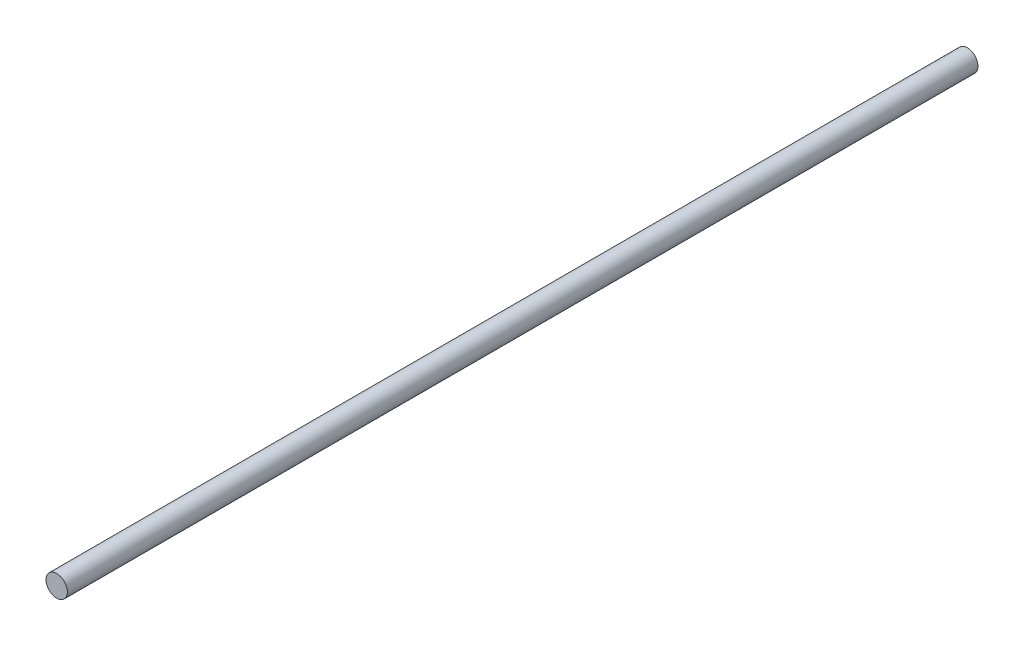
ISO-10303-21;
HEADER;
FILE_DESCRIPTION(('STEP AP214'),'2;1');
FILE_NAME('part.step','',(''),(''),'','','');
FILE_SCHEMA(('AUTOMOTIVE_DESIGN { 1 0 10303 214 1 1 1 1 }'));
ENDSEC;
DATA;
#1=APPLICATION_CONTEXT('core data for automotive mechanical design processes');
#2=APPLICATION_PROTOCOL_DEFINITION('international standard','automotive_design',2000,#1);
#3=PRODUCT_CONTEXT('',#1,'mechanical');
#4=PRODUCT('Part','Part','',(#3));
#5=PRODUCT_RELATED_PRODUCT_CATEGORY('part','',(#4));
#6=PRODUCT_DEFINITION_FORMATION('','',#4);
#7=PRODUCT_DEFINITION_CONTEXT('part definition',#1,'design');
#8=PRODUCT_DEFINITION('design','',#6,#7);
#9=PRODUCT_DEFINITION_SHAPE('','',#8);
#10=(LENGTH_UNIT() NAMED_UNIT(*) SI_UNIT(.MILLI.,.METRE.));
#11=(NAMED_UNIT(*) PLANE_ANGLE_UNIT() SI_UNIT($,.RADIAN.));
#12=(NAMED_UNIT(*) SI_UNIT($,.STERADIAN.) SOLID_ANGLE_UNIT());
#13=UNCERTAINTY_MEASURE_WITH_UNIT(LENGTH_MEASURE(1.E-05),#10,'distance_accuracy_value','');
#14=(GEOMETRIC_REPRESENTATION_CONTEXT(3) GLOBAL_UNCERTAINTY_ASSIGNED_CONTEXT((#13)) GLOBAL_UNIT_ASSIGNED_CONTEXT((#10,
#11,#12)) REPRESENTATION_CONTEXT('',''));
#15=CARTESIAN_POINT('',(0.,0.,0.));
#16=DIRECTION('',(0.,0.,1.));
#17=DIRECTION('',(1.,0.,0.));
#18=AXIS2_PLACEMENT_3D('',#15,#16,#17);
#19=CARTESIAN_POINT('',(0.,0.,510.));
#20=DIRECTION('',(0.,0.,-1.));
#21=DIRECTION('',(-1.,0.,0.));
#22=AXIS2_PLACEMENT_3D('',#19,#20,#21);
#23=CYLINDRICAL_SURFACE('',#22,6.);
#24=CARTESIAN_POINT('',(0.,0.,510.));
#25=DIRECTION('',(0.,0.,1.));
#26=DIRECTION('',(1.,0.,0.));
#27=AXIS2_PLACEMENT_3D('',#24,#25,#26);
#28=CIRCLE('',#27,6.);
#29=CARTESIAN_POINT('',(6.,0.,510.));
#30=VERTEX_POINT('',#29);
#31=EDGE_CURVE('E10',#30,#30,#28,.T.);
#32=ORIENTED_EDGE('',*,*,#31,.F.);
#33=EDGE_LOOP('',(#32));
#34=FACE_BOUND('',#33,.T.);
#35=CARTESIAN_POINT('',(0.,0.,0.));
#36=DIRECTION('',(0.,0.,1.));
#37=DIRECTION('',(1.,0.,0.));
#38=AXIS2_PLACEMENT_3D('',#35,#36,#37);
#39=CIRCLE('',#38,6.);
#40=CARTESIAN_POINT('',(6.,0.,0.));
#41=VERTEX_POINT('',#40);
#42=EDGE_CURVE('E40',#41,#41,#39,.T.);
#43=ORIENTED_EDGE('',*,*,#42,.T.);
#44=EDGE_LOOP('',(#43));
#45=FACE_BOUND('',#44,.T.);
#46=ADVANCED_FACE('F37',(#34,#45),#23,.T.);
#47=CARTESIAN_POINT('',(0.,0.,510.));
#48=DIRECTION('',(0.,0.,1.));
#49=DIRECTION('',(1.,0.,0.));
#50=AXIS2_PLACEMENT_3D('',#47,#48,#49);
#51=PLANE('',#50);
#52=ORIENTED_EDGE('',*,*,#31,.T.);
#53=EDGE_LOOP('',(#52));
#54=FACE_BOUND('',#53,.T.);
#55=ADVANCED_FACE('F54',(#54),#51,.T.);
#56=CARTESIAN_POINT('',(0.,0.,0.));
#57=DIRECTION('',(0.,0.,1.));
#58=DIRECTION('',(1.,0.,0.));
#59=AXIS2_PLACEMENT_3D('',#56,#57,#58);
#60=PLANE('',#59);
#61=ORIENTED_EDGE('',*,*,#42,.F.);
#62=EDGE_LOOP('',(#61));
#63=FACE_BOUND('',#62,.T.);
#64=ADVANCED_FACE('F52',(#63),#60,.F.);
#65=CLOSED_SHELL('',(#46,#55,#64));
#66=MANIFOLD_SOLID_BREP('B2',#65);
#67=ADVANCED_BREP_SHAPE_REPRESENTATION('',(#18,#66),#14);
#68=SHAPE_DEFINITION_REPRESENTATION(#9,#67);
ENDSEC;
END-ISO-10303-21;
